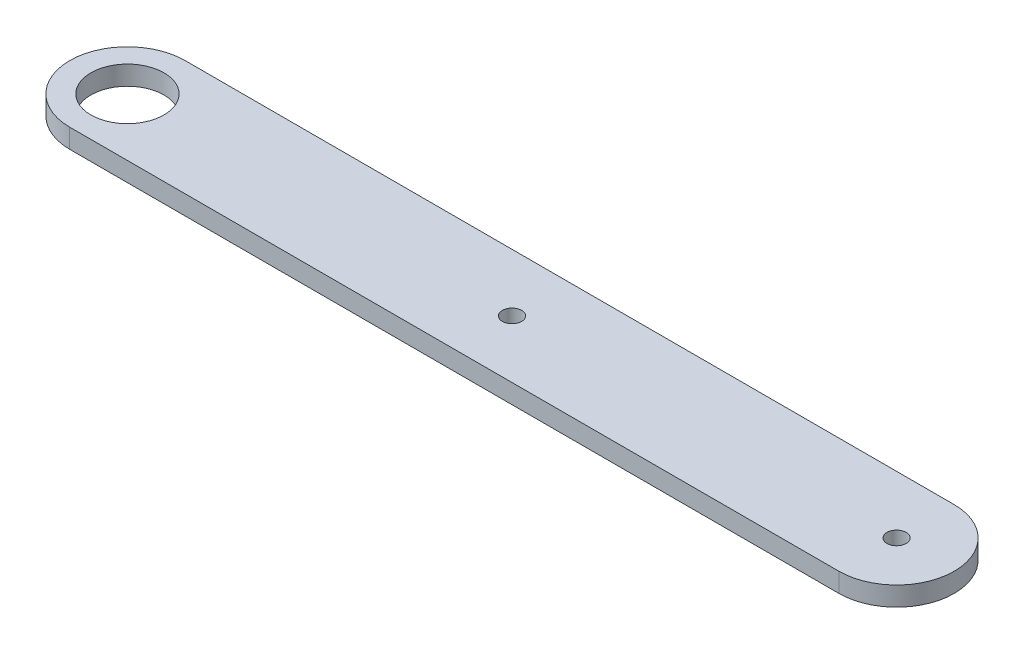
ISO-10303-21;
HEADER;
FILE_DESCRIPTION(('STEP AP214'),'2;1');
FILE_NAME('part.step','',(''),(''),'','','');
FILE_SCHEMA(('AUTOMOTIVE_DESIGN { 1 0 10303 214 1 1 1 1 }'));
ENDSEC;
DATA;
#1=APPLICATION_CONTEXT('core data for automotive mechanical design processes');
#2=APPLICATION_PROTOCOL_DEFINITION('international standard','automotive_design',2000,#1);
#3=PRODUCT_CONTEXT('',#1,'mechanical');
#4=PRODUCT('Part','Part','',(#3));
#5=PRODUCT_RELATED_PRODUCT_CATEGORY('part','',(#4));
#6=PRODUCT_DEFINITION_FORMATION('','',#4);
#7=PRODUCT_DEFINITION_CONTEXT('part definition',#1,'design');
#8=PRODUCT_DEFINITION('design','',#6,#7);
#9=PRODUCT_DEFINITION_SHAPE('','',#8);
#10=(LENGTH_UNIT() NAMED_UNIT(*) SI_UNIT(.MILLI.,.METRE.));
#11=(NAMED_UNIT(*) PLANE_ANGLE_UNIT() SI_UNIT($,.RADIAN.));
#12=(NAMED_UNIT(*) SI_UNIT($,.STERADIAN.) SOLID_ANGLE_UNIT());
#13=UNCERTAINTY_MEASURE_WITH_UNIT(LENGTH_MEASURE(1.E-05),#10,'distance_accuracy_value','');
#14=(GEOMETRIC_REPRESENTATION_CONTEXT(3) GLOBAL_UNCERTAINTY_ASSIGNED_CONTEXT((#13)) GLOBAL_UNIT_ASSIGNED_CONTEXT((#10,
#11,#12)) REPRESENTATION_CONTEXT('',''));
#15=CARTESIAN_POINT('',(0.,0.,0.));
#16=DIRECTION('',(0.,0.,1.));
#17=DIRECTION('',(1.,0.,0.));
#18=AXIS2_PLACEMENT_3D('',#15,#16,#17);
#19=CARTESIAN_POINT('',(0.,5.,0.));
#20=DIRECTION('',(0.,1.,0.));
#21=DIRECTION('',(0.,0.,1.));
#22=AXIS2_PLACEMENT_3D('',#19,#20,#21);
#23=PLANE('',#22);
#24=CARTESIAN_POINT('',(100.,5.,0.));
#25=DIRECTION('',(0.,1.,0.));
#26=DIRECTION('',(0.,0.,1.));
#27=AXIS2_PLACEMENT_3D('',#24,#25,#26);
#28=CIRCLE('',#27,2.5);
#29=CARTESIAN_POINT('',(100.,5.,2.5));
#30=VERTEX_POINT('',#29);
#31=EDGE_CURVE('E123',#30,#30,#28,.T.);
#32=ORIENTED_EDGE('',*,*,#31,.F.);
#33=EDGE_LOOP('',(#32));
#34=FACE_BOUND('',#33,.T.);
#35=CARTESIAN_POINT('',(0.,5.,0.));
#36=DIRECTION('',(0.,1.,0.));
#37=DIRECTION('',(0.,0.,1.));
#38=AXIS2_PLACEMENT_3D('',#35,#36,#37);
#39=CIRCLE('',#38,15.);
#40=CARTESIAN_POINT('',(0.,5.,-15.));
#41=VERTEX_POINT('',#40);
#42=CARTESIAN_POINT('',(0.,5.,15.));
#43=VERTEX_POINT('',#42);
#44=EDGE_CURVE('E93',#41,#43,#39,.T.);
#45=ORIENTED_EDGE('',*,*,#44,.T.);
#46=DIRECTION('',(1.,0.,0.));
#47=VECTOR('',#46,1.);
#48=CARTESIAN_POINT('',(0.,5.,15.));
#49=LINE('',#48,#47);
#50=CARTESIAN_POINT('',(200.,5.,15.));
#51=VERTEX_POINT('',#50);
#52=EDGE_CURVE('E88',#43,#51,#49,.T.);
#53=ORIENTED_EDGE('',*,*,#52,.T.);
#54=CARTESIAN_POINT('',(200.,5.,0.));
#55=DIRECTION('',(0.,1.,0.));
#56=DIRECTION('',(0.,0.,1.));
#57=AXIS2_PLACEMENT_3D('',#54,#55,#56);
#58=CIRCLE('',#57,15.);
#59=CARTESIAN_POINT('',(200.,5.,-15.));
#60=VERTEX_POINT('',#59);
#61=EDGE_CURVE('E91',#51,#60,#58,.T.);
#62=ORIENTED_EDGE('',*,*,#61,.T.);
#63=DIRECTION('',(-1.,0.,0.));
#64=VECTOR('',#63,1.);
#65=CARTESIAN_POINT('',(0.,5.,-15.));
#66=LINE('',#65,#64);
#67=EDGE_CURVE('E58',#60,#41,#66,.T.);
#68=ORIENTED_EDGE('',*,*,#67,.T.);
#69=EDGE_LOOP('',(#45,#53,#62,#68));
#70=FACE_BOUND('',#69,.T.);
#71=CARTESIAN_POINT('',(200.,5.,0.));
#72=DIRECTION('',(0.,1.,0.));
#73=DIRECTION('',(0.,0.,1.));
#74=AXIS2_PLACEMENT_3D('',#71,#72,#73);
#75=CIRCLE('',#74,2.5);
#76=CARTESIAN_POINT('',(200.,5.,2.5));
#77=VERTEX_POINT('',#76);
#78=EDGE_CURVE('E108',#77,#77,#75,.T.);
#79=ORIENTED_EDGE('',*,*,#78,.F.);
#80=EDGE_LOOP('',(#79));
#81=FACE_BOUND('',#80,.T.);
#82=CARTESIAN_POINT('',(0.,5.,0.));
#83=DIRECTION('',(0.,1.,0.));
#84=DIRECTION('',(0.,0.,1.));
#85=AXIS2_PLACEMENT_3D('',#82,#83,#84);
#86=CIRCLE('',#85,9.5);
#87=CARTESIAN_POINT('',(0.,5.,9.5));
#88=VERTEX_POINT('',#87);
#89=EDGE_CURVE('E129',#88,#88,#86,.T.);
#90=ORIENTED_EDGE('',*,*,#89,.F.);
#91=EDGE_LOOP('',(#90));
#92=FACE_BOUND('',#91,.T.);
#93=ADVANCED_FACE('F41',(#34,#70,#81,#92),#23,.T.);
#94=CARTESIAN_POINT('',(0.,0.,0.));
#95=DIRECTION('',(0.,1.,0.));
#96=DIRECTION('',(0.,0.,1.));
#97=AXIS2_PLACEMENT_3D('',#94,#95,#96);
#98=PLANE('',#97);
#99=CARTESIAN_POINT('',(0.,0.,0.));
#100=DIRECTION('',(0.,1.,0.));
#101=DIRECTION('',(0.,0.,1.));
#102=AXIS2_PLACEMENT_3D('',#99,#100,#101);
#103=CIRCLE('',#102,15.);
#104=CARTESIAN_POINT('',(0.,0.,-15.));
#105=VERTEX_POINT('',#104);
#106=CARTESIAN_POINT('',(0.,0.,15.));
#107=VERTEX_POINT('',#106);
#108=EDGE_CURVE('E105',#105,#107,#103,.T.);
#109=ORIENTED_EDGE('',*,*,#108,.F.);
#110=DIRECTION('',(-1.,0.,0.));
#111=VECTOR('',#110,1.);
#112=CARTESIAN_POINT('',(0.,0.,-15.));
#113=LINE('',#112,#111);
#114=CARTESIAN_POINT('',(200.,0.,-15.));
#115=VERTEX_POINT('',#114);
#116=EDGE_CURVE('E81',#115,#105,#113,.T.);
#117=ORIENTED_EDGE('',*,*,#116,.F.);
#118=CARTESIAN_POINT('',(200.,0.,0.));
#119=DIRECTION('',(0.,1.,0.));
#120=DIRECTION('',(0.,0.,1.));
#121=AXIS2_PLACEMENT_3D('',#118,#119,#120);
#122=CIRCLE('',#121,15.);
#123=CARTESIAN_POINT('',(200.,0.,15.));
#124=VERTEX_POINT('',#123);
#125=EDGE_CURVE('E75',#124,#115,#122,.T.);
#126=ORIENTED_EDGE('',*,*,#125,.F.);
#127=DIRECTION('',(1.,0.,0.));
#128=VECTOR('',#127,1.);
#129=CARTESIAN_POINT('',(0.,0.,15.));
#130=LINE('',#129,#128);
#131=EDGE_CURVE('E97',#107,#124,#130,.T.);
#132=ORIENTED_EDGE('',*,*,#131,.F.);
#133=EDGE_LOOP('',(#109,#117,#126,#132));
#134=FACE_BOUND('',#133,.T.);
#135=CARTESIAN_POINT('',(200.,0.,0.));
#136=DIRECTION('',(0.,1.,0.));
#137=DIRECTION('',(0.,0.,1.));
#138=AXIS2_PLACEMENT_3D('',#135,#136,#137);
#139=CIRCLE('',#138,2.5);
#140=CARTESIAN_POINT('',(200.,0.,2.5));
#141=VERTEX_POINT('',#140);
#142=EDGE_CURVE('E120',#141,#141,#139,.T.);
#143=ORIENTED_EDGE('',*,*,#142,.T.);
#144=EDGE_LOOP('',(#143));
#145=FACE_BOUND('',#144,.T.);
#146=CARTESIAN_POINT('',(100.,0.,0.));
#147=DIRECTION('',(0.,1.,0.));
#148=DIRECTION('',(0.,0.,1.));
#149=AXIS2_PLACEMENT_3D('',#146,#147,#148);
#150=CIRCLE('',#149,2.5);
#151=CARTESIAN_POINT('',(100.,0.,2.5));
#152=VERTEX_POINT('',#151);
#153=EDGE_CURVE('E126',#152,#152,#150,.T.);
#154=ORIENTED_EDGE('',*,*,#153,.T.);
#155=EDGE_LOOP('',(#154));
#156=FACE_BOUND('',#155,.T.);
#157=CARTESIAN_POINT('',(0.,0.,0.));
#158=DIRECTION('',(0.,1.,0.));
#159=DIRECTION('',(0.,0.,1.));
#160=AXIS2_PLACEMENT_3D('',#157,#158,#159);
#161=CIRCLE('',#160,9.5);
#162=CARTESIAN_POINT('',(0.,0.,9.5));
#163=VERTEX_POINT('',#162);
#164=EDGE_CURVE('E132',#163,#163,#161,.T.);
#165=ORIENTED_EDGE('',*,*,#164,.T.);
#166=EDGE_LOOP('',(#165));
#167=FACE_BOUND('',#166,.T.);
#168=ADVANCED_FACE('F116',(#134,#145,#156,#167),#98,.F.);
#169=CARTESIAN_POINT('',(0.,5.,0.));
#170=DIRECTION('',(0.,-1.,0.));
#171=DIRECTION('',(0.,0.,-1.));
#172=AXIS2_PLACEMENT_3D('',#169,#170,#171);
#173=CYLINDRICAL_SURFACE('',#172,15.);
#174=ORIENTED_EDGE('',*,*,#108,.T.);
#175=DIRECTION('',(0.,-1.,0.));
#176=VECTOR('',#175,1.);
#177=CARTESIAN_POINT('',(0.,5.,15.));
#178=LINE('',#177,#176);
#179=EDGE_CURVE('E11',#43,#107,#178,.T.);
#180=ORIENTED_EDGE('',*,*,#179,.F.);
#181=ORIENTED_EDGE('',*,*,#44,.F.);
#182=DIRECTION('',(0.,-1.,0.));
#183=VECTOR('',#182,1.);
#184=CARTESIAN_POINT('',(0.,5.,-15.));
#185=LINE('',#184,#183);
#186=EDGE_CURVE('E101',#41,#105,#185,.T.);
#187=ORIENTED_EDGE('',*,*,#186,.T.);
#188=EDGE_LOOP('',(#174,#180,#181,#187));
#189=FACE_BOUND('',#188,.T.);
#190=ADVANCED_FACE('F43',(#189),#173,.T.);
#191=CARTESIAN_POINT('',(0.,5.,15.));
#192=DIRECTION('',(0.,0.,-1.));
#193=DIRECTION('',(-1.,0.,0.));
#194=AXIS2_PLACEMENT_3D('',#191,#192,#193);
#195=PLANE('',#194);
#196=ORIENTED_EDGE('',*,*,#131,.T.);
#197=DIRECTION('',(0.,-1.,0.));
#198=VECTOR('',#197,1.);
#199=CARTESIAN_POINT('',(200.,5.,15.));
#200=LINE('',#199,#198);
#201=EDGE_CURVE('E50',#51,#124,#200,.T.);
#202=ORIENTED_EDGE('',*,*,#201,.F.);
#203=ORIENTED_EDGE('',*,*,#52,.F.);
#204=ORIENTED_EDGE('',*,*,#179,.T.);
#205=EDGE_LOOP('',(#196,#202,#203,#204));
#206=FACE_BOUND('',#205,.T.);
#207=ADVANCED_FACE('F96',(#206),#195,.F.);
#208=CARTESIAN_POINT('',(200.,5.,0.));
#209=DIRECTION('',(0.,-1.,0.));
#210=DIRECTION('',(0.,0.,-1.));
#211=AXIS2_PLACEMENT_3D('',#208,#209,#210);
#212=CYLINDRICAL_SURFACE('',#211,15.);
#213=ORIENTED_EDGE('',*,*,#125,.T.);
#214=DIRECTION('',(0.,-1.,0.));
#215=VECTOR('',#214,1.);
#216=CARTESIAN_POINT('',(200.,5.,-15.));
#217=LINE('',#216,#215);
#218=EDGE_CURVE('E98',#60,#115,#217,.T.);
#219=ORIENTED_EDGE('',*,*,#218,.F.);
#220=ORIENTED_EDGE('',*,*,#61,.F.);
#221=ORIENTED_EDGE('',*,*,#201,.T.);
#222=EDGE_LOOP('',(#213,#219,#220,#221));
#223=FACE_BOUND('',#222,.T.);
#224=ADVANCED_FACE('F99',(#223),#212,.T.);
#225=CARTESIAN_POINT('',(0.,5.,-15.));
#226=DIRECTION('',(0.,0.,1.));
#227=DIRECTION('',(1.,0.,0.));
#228=AXIS2_PLACEMENT_3D('',#225,#226,#227);
#229=PLANE('',#228);
#230=ORIENTED_EDGE('',*,*,#116,.T.);
#231=ORIENTED_EDGE('',*,*,#186,.F.);
#232=ORIENTED_EDGE('',*,*,#67,.F.);
#233=ORIENTED_EDGE('',*,*,#218,.T.);
#234=EDGE_LOOP('',(#230,#231,#232,#233));
#235=FACE_BOUND('',#234,.T.);
#236=ADVANCED_FACE('F113',(#235),#229,.F.);
#237=CARTESIAN_POINT('',(200.,5.,0.));
#238=DIRECTION('',(0.,-1.,0.));
#239=DIRECTION('',(0.,0.,-1.));
#240=AXIS2_PLACEMENT_3D('',#237,#238,#239);
#241=CYLINDRICAL_SURFACE('',#240,2.5);
#242=ORIENTED_EDGE('',*,*,#78,.T.);
#243=EDGE_LOOP('',(#242));
#244=FACE_BOUND('',#243,.T.);
#245=ORIENTED_EDGE('',*,*,#142,.F.);
#246=EDGE_LOOP('',(#245));
#247=FACE_BOUND('',#246,.T.);
#248=ADVANCED_FACE('F150',(#244,#247),#241,.F.);
#249=CARTESIAN_POINT('',(100.,5.,0.));
#250=DIRECTION('',(0.,-1.,0.));
#251=DIRECTION('',(0.,0.,-1.));
#252=AXIS2_PLACEMENT_3D('',#249,#250,#251);
#253=CYLINDRICAL_SURFACE('',#252,2.5);
#254=ORIENTED_EDGE('',*,*,#31,.T.);
#255=EDGE_LOOP('',(#254));
#256=FACE_BOUND('',#255,.T.);
#257=ORIENTED_EDGE('',*,*,#153,.F.);
#258=EDGE_LOOP('',(#257));
#259=FACE_BOUND('',#258,.T.);
#260=ADVANCED_FACE('F195',(#256,#259),#253,.F.);
#261=CARTESIAN_POINT('',(0.,5.,0.));
#262=DIRECTION('',(0.,-1.,0.));
#263=DIRECTION('',(0.,0.,-1.));
#264=AXIS2_PLACEMENT_3D('',#261,#262,#263);
#265=CYLINDRICAL_SURFACE('',#264,9.5);
#266=ORIENTED_EDGE('',*,*,#89,.T.);
#267=EDGE_LOOP('',(#266));
#268=FACE_BOUND('',#267,.T.);
#269=ORIENTED_EDGE('',*,*,#164,.F.);
#270=EDGE_LOOP('',(#269));
#271=FACE_BOUND('',#270,.T.);
#272=ADVANCED_FACE('F138',(#268,#271),#265,.F.);
#273=CLOSED_SHELL('',(#93,#168,#190,#207,#224,#236,#248,#260,#272));
#274=MANIFOLD_SOLID_BREP('B2',#273);
#275=ADVANCED_BREP_SHAPE_REPRESENTATION('',(#18,#274),#14);
#276=SHAPE_DEFINITION_REPRESENTATION(#9,#275);
ENDSEC;
END-ISO-10303-21;
